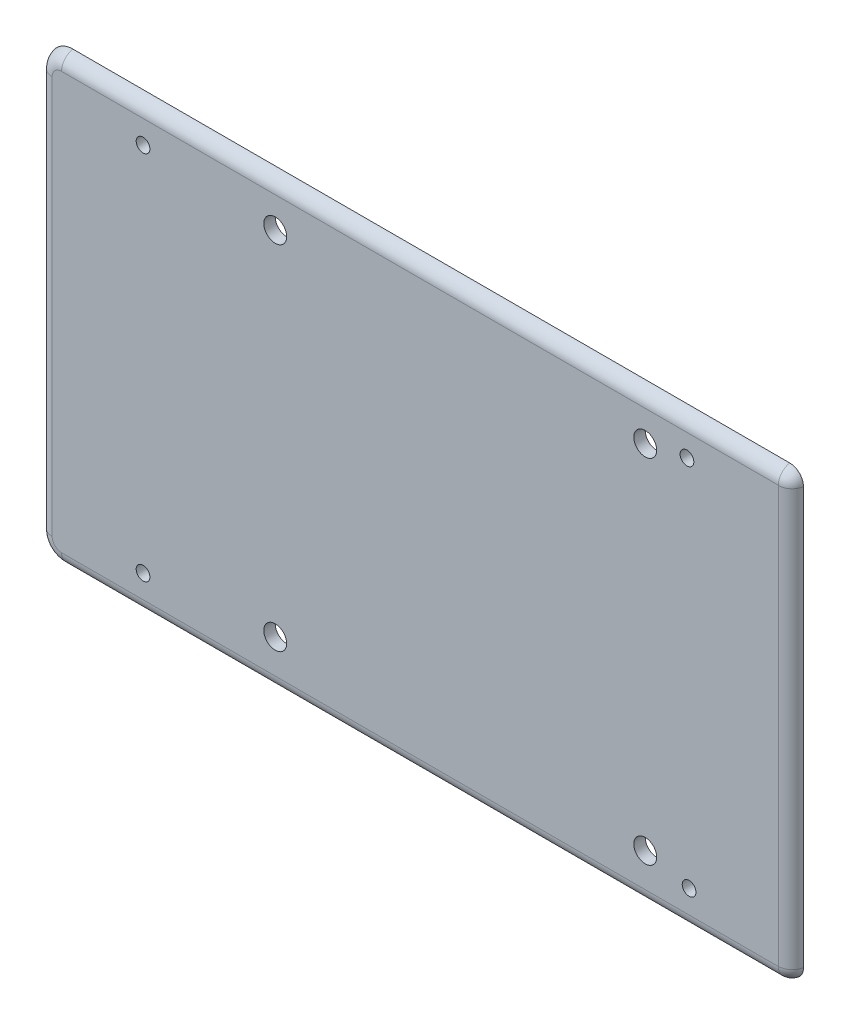
ISO-10303-21;
HEADER;
FILE_DESCRIPTION(('STEP AP214'),'2;1');
FILE_NAME('part.step','',(''),(''),'','','');
FILE_SCHEMA(('AUTOMOTIVE_DESIGN { 1 0 10303 214 1 1 1 1 }'));
ENDSEC;
DATA;
#1=APPLICATION_CONTEXT('core data for automotive mechanical design processes');
#2=APPLICATION_PROTOCOL_DEFINITION('international standard','automotive_design',2000,#1);
#3=PRODUCT_CONTEXT('',#1,'mechanical');
#4=PRODUCT('Part','Part','',(#3));
#5=PRODUCT_RELATED_PRODUCT_CATEGORY('part','',(#4));
#6=PRODUCT_DEFINITION_FORMATION('','',#4);
#7=PRODUCT_DEFINITION_CONTEXT('part definition',#1,'design');
#8=PRODUCT_DEFINITION('design','',#6,#7);
#9=PRODUCT_DEFINITION_SHAPE('','',#8);
#10=(LENGTH_UNIT() NAMED_UNIT(*) SI_UNIT(.MILLI.,.METRE.));
#11=(NAMED_UNIT(*) PLANE_ANGLE_UNIT() SI_UNIT($,.RADIAN.));
#12=(NAMED_UNIT(*) SI_UNIT($,.STERADIAN.) SOLID_ANGLE_UNIT());
#13=UNCERTAINTY_MEASURE_WITH_UNIT(LENGTH_MEASURE(1.E-05),#10,'distance_accuracy_value','');
#14=(GEOMETRIC_REPRESENTATION_CONTEXT(3) GLOBAL_UNCERTAINTY_ASSIGNED_CONTEXT((#13)) GLOBAL_UNIT_ASSIGNED_CONTEXT((#10,
#11,#12)) REPRESENTATION_CONTEXT('',''));
#15=CARTESIAN_POINT('',(0.,0.,0.));
#16=DIRECTION('',(0.,0.,1.));
#17=DIRECTION('',(1.,0.,0.));
#18=AXIS2_PLACEMENT_3D('',#15,#16,#17);
#19=CARTESIAN_POINT('',(-66.8142757664545,92.,2.5));
#20=DIRECTION('',(0.,0.,1.));
#21=DIRECTION('',(1.,0.,0.));
#22=AXIS2_PLACEMENT_3D('',#19,#20,#21);
#23=PLANE('',#22);
#24=DIRECTION('',(-1.,0.,0.));
#25=VECTOR('',#24,1.);
#26=CARTESIAN_POINT('',(89.8153903754205,2.95803989154979,2.5));
#27=LINE('',#26,#25);
#28=CARTESIAN_POINT('',(-66.8142757664545,2.95803989154981,2.5));
#29=VERTEX_POINT('',#28);
#30=CARTESIAN_POINT('',(89.8153903754205,2.95803989154979,2.5));
#31=VERTEX_POINT('',#30);
#32=EDGE_CURVE('E42',#29,#31,#27,.F.);
#33=ORIENTED_EDGE('',*,*,#32,.T.);
#34=CARTESIAN_POINT('',(89.8153903754205,2.99999999999998,2.5));
#35=DIRECTION('',(0.,0.,1.));
#36=DIRECTION('',(1.,0.,0.));
#37=AXIS2_PLACEMENT_3D('',#34,#35,#36);
#38=CIRCLE('',#37,0.0419601084501934);
#39=CARTESIAN_POINT('',(89.8573504838707,2.99999999999998,2.5));
#40=VERTEX_POINT('',#39);
#41=EDGE_CURVE('E11',#31,#40,#38,.T.);
#42=ORIENTED_EDGE('',*,*,#41,.T.);
#43=DIRECTION('',(0.,-1.,0.));
#44=VECTOR('',#43,1.);
#45=CARTESIAN_POINT('',(89.8573504838707,94.,2.5));
#46=LINE('',#45,#44);
#47=CARTESIAN_POINT('',(89.8573504838707,94.,2.5));
#48=VERTEX_POINT('',#47);
#49=EDGE_CURVE('E152',#40,#48,#46,.F.);
#50=ORIENTED_EDGE('',*,*,#49,.T.);
#51=CARTESIAN_POINT('',(89.8153903754205,94.,2.5));
#52=DIRECTION('',(0.,0.,1.));
#53=DIRECTION('',(1.,0.,0.));
#54=AXIS2_PLACEMENT_3D('',#51,#52,#53);
#55=CIRCLE('',#54,0.0419601084502012);
#56=CARTESIAN_POINT('',(89.8153903754205,94.0419601084502,2.5));
#57=VERTEX_POINT('',#56);
#58=EDGE_CURVE('E150',#48,#57,#55,.T.);
#59=ORIENTED_EDGE('',*,*,#58,.T.);
#60=DIRECTION('',(1.,0.,0.));
#61=VECTOR('',#60,1.);
#62=CARTESIAN_POINT('',(-66.8142757664545,94.0419601084502,2.5));
#63=LINE('',#62,#61);
#64=CARTESIAN_POINT('',(-66.8142757664545,94.0419601084502,2.5));
#65=VERTEX_POINT('',#64);
#66=EDGE_CURVE('E148',#57,#65,#63,.F.);
#67=ORIENTED_EDGE('',*,*,#66,.T.);
#68=CARTESIAN_POINT('',(-66.8142757664545,92.,2.5));
#69=DIRECTION('',(0.,0.,1.));
#70=DIRECTION('',(1.,0.,0.));
#71=AXIS2_PLACEMENT_3D('',#68,#69,#70);
#72=CIRCLE('',#71,2.0419601084502);
#73=CARTESIAN_POINT('',(-68.8562358749047,92.,2.5));
#74=VERTEX_POINT('',#73);
#75=EDGE_CURVE('E146',#65,#74,#72,.T.);
#76=ORIENTED_EDGE('',*,*,#75,.T.);
#77=DIRECTION('',(0.,1.,0.));
#78=VECTOR('',#77,1.);
#79=CARTESIAN_POINT('',(-68.8562358749048,5.,2.5));
#80=LINE('',#79,#78);
#81=CARTESIAN_POINT('',(-68.8562358749048,5.,2.5));
#82=VERTEX_POINT('',#81);
#83=EDGE_CURVE('E120',#74,#82,#80,.F.);
#84=ORIENTED_EDGE('',*,*,#83,.T.);
#85=CARTESIAN_POINT('',(-66.8142757664546,5.,2.5));
#86=DIRECTION('',(0.,0.,1.));
#87=DIRECTION('',(1.,0.,0.));
#88=AXIS2_PLACEMENT_3D('',#85,#86,#87);
#89=CIRCLE('',#88,2.0419601084502);
#90=EDGE_CURVE('E53',#82,#29,#89,.T.);
#91=ORIENTED_EDGE('',*,*,#90,.T.);
#92=EDGE_LOOP('',(#33,#42,#50,#59,#67,#76,#84,#91));
#93=FACE_BOUND('',#92,.T.);
#94=CARTESIAN_POINT('',(60.7315456513945,87.3502466896968,2.5));
#95=DIRECTION('',(0.,0.,1.));
#96=DIRECTION('',(1.,0.,0.));
#97=AXIS2_PLACEMENT_3D('',#94,#95,#96);
#98=CIRCLE('',#97,2.5);
#99=CARTESIAN_POINT('',(63.2315456513945,87.3502466896968,2.5));
#100=VERTEX_POINT('',#99);
#101=EDGE_CURVE('E205',#100,#100,#98,.T.);
#102=ORIENTED_EDGE('',*,*,#101,.F.);
#103=EDGE_LOOP('',(#102));
#104=FACE_BOUND('',#103,.T.);
#105=CARTESIAN_POINT('',(-20.1175901510747,10.3502466896967,2.5));
#106=DIRECTION('',(0.,0.,1.));
#107=DIRECTION('',(1.,0.,0.));
#108=AXIS2_PLACEMENT_3D('',#105,#106,#107);
#109=CIRCLE('',#108,2.50000000000001);
#110=CARTESIAN_POINT('',(-17.6175901510747,10.3502466896967,2.5));
#111=VERTEX_POINT('',#110);
#112=EDGE_CURVE('E199',#111,#111,#109,.T.);
#113=ORIENTED_EDGE('',*,*,#112,.F.);
#114=EDGE_LOOP('',(#113));
#115=FACE_BOUND('',#114,.T.);
#116=CARTESIAN_POINT('',(-20.1175901510747,87.3502466896968,2.5));
#117=DIRECTION('',(0.,0.,1.));
#118=DIRECTION('',(1.,0.,0.));
#119=AXIS2_PLACEMENT_3D('',#116,#117,#118);
#120=CIRCLE('',#119,2.50000000000001);
#121=CARTESIAN_POINT('',(-17.6175901510747,87.3502466896968,2.5));
#122=VERTEX_POINT('',#121);
#123=EDGE_CURVE('E121',#122,#122,#120,.T.);
#124=ORIENTED_EDGE('',*,*,#123,.F.);
#125=EDGE_LOOP('',(#124));
#126=FACE_BOUND('',#125,.T.);
#127=CARTESIAN_POINT('',(60.7315456513945,10.3502466896967,2.5));
#128=DIRECTION('',(0.,0.,1.));
#129=DIRECTION('',(1.,0.,0.));
#130=AXIS2_PLACEMENT_3D('',#127,#128,#129);
#131=CIRCLE('',#130,2.5);
#132=CARTESIAN_POINT('',(63.2315456513945,10.3502466896967,2.5));
#133=VERTEX_POINT('',#132);
#134=EDGE_CURVE('E193',#133,#133,#131,.T.);
#135=ORIENTED_EDGE('',*,*,#134,.F.);
#136=EDGE_LOOP('',(#135));
#137=FACE_BOUND('',#136,.T.);
#138=CARTESIAN_POINT('',(-49.,8.,2.5));
#139=DIRECTION('',(0.,0.,1.));
#140=DIRECTION('',(1.,0.,0.));
#141=AXIS2_PLACEMENT_3D('',#138,#139,#140);
#142=CIRCLE('',#141,1.5);
#143=CARTESIAN_POINT('',(-47.5,8.,2.5));
#144=VERTEX_POINT('',#143);
#145=EDGE_CURVE('E178',#144,#144,#142,.T.);
#146=ORIENTED_EDGE('',*,*,#145,.F.);
#147=EDGE_LOOP('',(#146));
#148=FACE_BOUND('',#147,.T.);
#149=CARTESIAN_POINT('',(69.8502021664019,89.2089025838735,2.5));
#150=DIRECTION('',(0.,0.,1.));
#151=DIRECTION('',(1.,0.,0.));
#152=AXIS2_PLACEMENT_3D('',#149,#150,#151);
#153=CIRCLE('',#152,1.5);
#154=CARTESIAN_POINT('',(71.3502021664019,89.2089025838735,2.5));
#155=VERTEX_POINT('',#154);
#156=EDGE_CURVE('E117',#155,#155,#153,.T.);
#157=ORIENTED_EDGE('',*,*,#156,.F.);
#158=EDGE_LOOP('',(#157));
#159=FACE_BOUND('',#158,.T.);
#160=CARTESIAN_POINT('',(-49.,89.,2.5));
#161=DIRECTION('',(0.,0.,1.));
#162=DIRECTION('',(1.,0.,0.));
#163=AXIS2_PLACEMENT_3D('',#160,#161,#162);
#164=CIRCLE('',#163,1.5);
#165=CARTESIAN_POINT('',(-47.5,89.,2.5));
#166=VERTEX_POINT('',#165);
#167=EDGE_CURVE('E172',#166,#166,#164,.T.);
#168=ORIENTED_EDGE('',*,*,#167,.F.);
#169=EDGE_LOOP('',(#168));
#170=FACE_BOUND('',#169,.T.);
#171=CARTESIAN_POINT('',(70.3153903754205,7.99999999999998,2.5));
#172=DIRECTION('',(0.,0.,1.));
#173=DIRECTION('',(1.,0.,0.));
#174=AXIS2_PLACEMENT_3D('',#171,#172,#173);
#175=CIRCLE('',#174,1.5);
#176=CARTESIAN_POINT('',(71.8153903754205,7.99999999999998,2.5));
#177=VERTEX_POINT('',#176);
#178=EDGE_CURVE('E184',#177,#177,#175,.T.);
#179=ORIENTED_EDGE('',*,*,#178,.F.);
#180=EDGE_LOOP('',(#179));
#181=FACE_BOUND('',#180,.T.);
#182=ADVANCED_FACE('F33',(#93,#104,#115,#126,#137,#148,#159,#170,#181),#23,.T.);
#183=CARTESIAN_POINT('',(-66.8142757664545,92.,0.));
#184=DIRECTION('',(0.,0.,1.));
#185=DIRECTION('',(1.,0.,0.));
#186=AXIS2_PLACEMENT_3D('',#183,#184,#185);
#187=PLANE('',#186);
#188=CARTESIAN_POINT('',(60.7315456513945,87.3502466896968,0.));
#189=DIRECTION('',(0.,0.,1.));
#190=DIRECTION('',(1.,0.,0.));
#191=AXIS2_PLACEMENT_3D('',#188,#189,#190);
#192=CIRCLE('',#191,2.5);
#193=CARTESIAN_POINT('',(63.2315456513945,87.3502466896968,0.));
#194=VERTEX_POINT('',#193);
#195=EDGE_CURVE('E196',#194,#194,#192,.T.);
#196=ORIENTED_EDGE('',*,*,#195,.T.);
#197=EDGE_LOOP('',(#196));
#198=FACE_BOUND('',#197,.T.);
#199=CARTESIAN_POINT('',(-20.1175901510747,10.3502466896967,0.));
#200=DIRECTION('',(0.,0.,1.));
#201=DIRECTION('',(1.,0.,0.));
#202=AXIS2_PLACEMENT_3D('',#199,#200,#201);
#203=CIRCLE('',#202,2.50000000000001);
#204=CARTESIAN_POINT('',(-17.6175901510747,10.3502466896967,0.));
#205=VERTEX_POINT('',#204);
#206=EDGE_CURVE('E202',#205,#205,#203,.T.);
#207=ORIENTED_EDGE('',*,*,#206,.T.);
#208=EDGE_LOOP('',(#207));
#209=FACE_BOUND('',#208,.T.);
#210=CARTESIAN_POINT('',(-20.1175901510747,87.3502466896968,0.));
#211=DIRECTION('',(0.,0.,1.));
#212=DIRECTION('',(1.,0.,0.));
#213=AXIS2_PLACEMENT_3D('',#210,#211,#212);
#214=CIRCLE('',#213,2.50000000000001);
#215=CARTESIAN_POINT('',(-17.6175901510747,87.3502466896968,0.));
#216=VERTEX_POINT('',#215);
#217=EDGE_CURVE('E123',#216,#216,#214,.T.);
#218=ORIENTED_EDGE('',*,*,#217,.T.);
#219=EDGE_LOOP('',(#218));
#220=FACE_BOUND('',#219,.T.);
#221=CARTESIAN_POINT('',(60.7315456513945,10.3502466896967,0.));
#222=DIRECTION('',(0.,0.,1.));
#223=DIRECTION('',(1.,0.,0.));
#224=AXIS2_PLACEMENT_3D('',#221,#222,#223);
#225=CIRCLE('',#224,2.5);
#226=CARTESIAN_POINT('',(63.2315456513945,10.3502466896967,0.));
#227=VERTEX_POINT('',#226);
#228=EDGE_CURVE('E190',#227,#227,#225,.T.);
#229=ORIENTED_EDGE('',*,*,#228,.T.);
#230=EDGE_LOOP('',(#229));
#231=FACE_BOUND('',#230,.T.);
#232=CARTESIAN_POINT('',(-66.8142757664545,92.,0.));
#233=DIRECTION('',(0.,0.,1.));
#234=DIRECTION('',(1.,0.,0.));
#235=AXIS2_PLACEMENT_3D('',#232,#233,#234);
#236=CIRCLE('',#235,5.);
#237=CARTESIAN_POINT('',(-66.8142757664545,97.,0.));
#238=VERTEX_POINT('',#237);
#239=CARTESIAN_POINT('',(-71.8142757664545,92.,0.));
#240=VERTEX_POINT('',#239);
#241=EDGE_CURVE('E101',#238,#240,#236,.T.);
#242=ORIENTED_EDGE('',*,*,#241,.F.);
#243=DIRECTION('',(-1.,0.,0.));
#244=VECTOR('',#243,1.);
#245=CARTESIAN_POINT('',(89.8153903754205,97.,0.));
#246=LINE('',#245,#244);
#247=CARTESIAN_POINT('',(89.8153903754205,97.,0.));
#248=VERTEX_POINT('',#247);
#249=EDGE_CURVE('E154',#248,#238,#246,.T.);
#250=ORIENTED_EDGE('',*,*,#249,.F.);
#251=CARTESIAN_POINT('',(89.8153903754205,94.,0.));
#252=DIRECTION('',(0.,0.,1.));
#253=DIRECTION('',(1.,0.,0.));
#254=AXIS2_PLACEMENT_3D('',#251,#252,#253);
#255=CIRCLE('',#254,3.00000000000001);
#256=CARTESIAN_POINT('',(92.8153903754205,94.,0.));
#257=VERTEX_POINT('',#256);
#258=EDGE_CURVE('E156',#257,#248,#255,.T.);
#259=ORIENTED_EDGE('',*,*,#258,.F.);
#260=DIRECTION('',(0.,1.,0.));
#261=VECTOR('',#260,1.);
#262=CARTESIAN_POINT('',(92.8153903754205,2.99999999999998,0.));
#263=LINE('',#262,#261);
#264=CARTESIAN_POINT('',(92.8153903754205,2.99999999999998,0.));
#265=VERTEX_POINT('',#264);
#266=EDGE_CURVE('E159',#265,#257,#263,.T.);
#267=ORIENTED_EDGE('',*,*,#266,.F.);
#268=CARTESIAN_POINT('',(89.8153903754205,2.99999999999998,0.));
#269=DIRECTION('',(0.,0.,1.));
#270=DIRECTION('',(1.,0.,0.));
#271=AXIS2_PLACEMENT_3D('',#268,#269,#270);
#272=CIRCLE('',#271,3.);
#273=CARTESIAN_POINT('',(89.8153903754205,0.,0.));
#274=VERTEX_POINT('',#273);
#275=EDGE_CURVE('E162',#274,#265,#272,.T.);
#276=ORIENTED_EDGE('',*,*,#275,.F.);
#277=DIRECTION('',(1.,0.,0.));
#278=VECTOR('',#277,1.);
#279=CARTESIAN_POINT('',(-66.8142757664545,0.,0.));
#280=LINE('',#279,#278);
#281=CARTESIAN_POINT('',(-66.8142757664545,0.,0.));
#282=VERTEX_POINT('',#281);
#283=EDGE_CURVE('E165',#282,#274,#280,.T.);
#284=ORIENTED_EDGE('',*,*,#283,.F.);
#285=CARTESIAN_POINT('',(-66.8142757664546,5.,0.));
#286=DIRECTION('',(0.,0.,1.));
#287=DIRECTION('',(1.,0.,0.));
#288=AXIS2_PLACEMENT_3D('',#285,#286,#287);
#289=CIRCLE('',#288,5.);
#290=CARTESIAN_POINT('',(-71.8142757664546,5.,0.));
#291=VERTEX_POINT('',#290);
#292=EDGE_CURVE('E104',#291,#282,#289,.T.);
#293=ORIENTED_EDGE('',*,*,#292,.F.);
#294=DIRECTION('',(0.,-1.,0.));
#295=VECTOR('',#294,1.);
#296=CARTESIAN_POINT('',(-71.8142757664545,92.,0.));
#297=LINE('',#296,#295);
#298=EDGE_CURVE('E97',#240,#291,#297,.T.);
#299=ORIENTED_EDGE('',*,*,#298,.F.);
#300=EDGE_LOOP('',(#242,#250,#259,#267,#276,#284,#293,#299));
#301=FACE_BOUND('',#300,.T.);
#302=CARTESIAN_POINT('',(69.8502021664019,89.2089025838735,0.));
#303=DIRECTION('',(0.,0.,1.));
#304=DIRECTION('',(1.,0.,0.));
#305=AXIS2_PLACEMENT_3D('',#302,#303,#304);
#306=CIRCLE('',#305,1.5);
#307=CARTESIAN_POINT('',(71.3502021664019,89.2089025838735,0.));
#308=VERTEX_POINT('',#307);
#309=EDGE_CURVE('E169',#308,#308,#306,.T.);
#310=ORIENTED_EDGE('',*,*,#309,.T.);
#311=EDGE_LOOP('',(#310));
#312=FACE_BOUND('',#311,.T.);
#313=CARTESIAN_POINT('',(-49.,89.,0.));
#314=DIRECTION('',(0.,0.,1.));
#315=DIRECTION('',(1.,0.,0.));
#316=AXIS2_PLACEMENT_3D('',#313,#314,#315);
#317=CIRCLE('',#316,1.5);
#318=CARTESIAN_POINT('',(-47.5,89.,0.));
#319=VERTEX_POINT('',#318);
#320=EDGE_CURVE('E175',#319,#319,#317,.T.);
#321=ORIENTED_EDGE('',*,*,#320,.T.);
#322=EDGE_LOOP('',(#321));
#323=FACE_BOUND('',#322,.T.);
#324=CARTESIAN_POINT('',(-49.,8.,0.));
#325=DIRECTION('',(0.,0.,1.));
#326=DIRECTION('',(1.,0.,0.));
#327=AXIS2_PLACEMENT_3D('',#324,#325,#326);
#328=CIRCLE('',#327,1.5);
#329=CARTESIAN_POINT('',(-47.5,8.,0.));
#330=VERTEX_POINT('',#329);
#331=EDGE_CURVE('E181',#330,#330,#328,.T.);
#332=ORIENTED_EDGE('',*,*,#331,.T.);
#333=EDGE_LOOP('',(#332));
#334=FACE_BOUND('',#333,.T.);
#335=CARTESIAN_POINT('',(70.3153903754205,7.99999999999998,0.));
#336=DIRECTION('',(0.,0.,1.));
#337=DIRECTION('',(1.,0.,0.));
#338=AXIS2_PLACEMENT_3D('',#335,#336,#337);
#339=CIRCLE('',#338,1.5);
#340=CARTESIAN_POINT('',(71.8153903754205,7.99999999999998,0.));
#341=VERTEX_POINT('',#340);
#342=EDGE_CURVE('E187',#341,#341,#339,.T.);
#343=ORIENTED_EDGE('',*,*,#342,.T.);
#344=EDGE_LOOP('',(#343));
#345=FACE_BOUND('',#344,.T.);
#346=ADVANCED_FACE('F99',(#198,#209,#220,#231,#301,#312,#323,#334,#345),#187,.F.);
#347=CARTESIAN_POINT('',(69.8502021664019,89.2089025838735,2.5));
#348=DIRECTION('',(0.,0.,-1.));
#349=DIRECTION('',(-1.,0.,0.));
#350=AXIS2_PLACEMENT_3D('',#347,#348,#349);
#351=CYLINDRICAL_SURFACE('',#350,1.5);
#352=ORIENTED_EDGE('',*,*,#156,.T.);
#353=EDGE_LOOP('',(#352));
#354=FACE_BOUND('',#353,.T.);
#355=ORIENTED_EDGE('',*,*,#309,.F.);
#356=EDGE_LOOP('',(#355));
#357=FACE_BOUND('',#356,.T.);
#358=ADVANCED_FACE('F244',(#354,#357),#351,.F.);
#359=CARTESIAN_POINT('',(-49.,89.,2.5));
#360=DIRECTION('',(0.,0.,-1.));
#361=DIRECTION('',(-1.,0.,0.));
#362=AXIS2_PLACEMENT_3D('',#359,#360,#361);
#363=CYLINDRICAL_SURFACE('',#362,1.5);
#364=ORIENTED_EDGE('',*,*,#167,.T.);
#365=EDGE_LOOP('',(#364));
#366=FACE_BOUND('',#365,.T.);
#367=ORIENTED_EDGE('',*,*,#320,.F.);
#368=EDGE_LOOP('',(#367));
#369=FACE_BOUND('',#368,.T.);
#370=ADVANCED_FACE('F250',(#366,#369),#363,.F.);
#371=CARTESIAN_POINT('',(-49.,8.,2.5));
#372=DIRECTION('',(0.,0.,-1.));
#373=DIRECTION('',(-1.,0.,0.));
#374=AXIS2_PLACEMENT_3D('',#371,#372,#373);
#375=CYLINDRICAL_SURFACE('',#374,1.5);
#376=ORIENTED_EDGE('',*,*,#145,.T.);
#377=EDGE_LOOP('',(#376));
#378=FACE_BOUND('',#377,.T.);
#379=ORIENTED_EDGE('',*,*,#331,.F.);
#380=EDGE_LOOP('',(#379));
#381=FACE_BOUND('',#380,.T.);
#382=ADVANCED_FACE('F239',(#378,#381),#375,.F.);
#383=CARTESIAN_POINT('',(70.3153903754205,7.99999999999998,2.5));
#384=DIRECTION('',(0.,0.,-1.));
#385=DIRECTION('',(-1.,0.,0.));
#386=AXIS2_PLACEMENT_3D('',#383,#384,#385);
#387=CYLINDRICAL_SURFACE('',#386,1.5);
#388=ORIENTED_EDGE('',*,*,#178,.T.);
#389=EDGE_LOOP('',(#388));
#390=FACE_BOUND('',#389,.T.);
#391=ORIENTED_EDGE('',*,*,#342,.F.);
#392=EDGE_LOOP('',(#391));
#393=FACE_BOUND('',#392,.T.);
#394=ADVANCED_FACE('F236',(#390,#393),#387,.F.);
#395=CARTESIAN_POINT('',(60.7315456513945,10.3502466896967,0.));
#396=DIRECTION('',(0.,0.,1.));
#397=DIRECTION('',(1.,0.,0.));
#398=AXIS2_PLACEMENT_3D('',#395,#396,#397);
#399=CYLINDRICAL_SURFACE('',#398,2.5);
#400=ORIENTED_EDGE('',*,*,#228,.F.);
#401=EDGE_LOOP('',(#400));
#402=FACE_BOUND('',#401,.T.);
#403=ORIENTED_EDGE('',*,*,#134,.T.);
#404=EDGE_LOOP('',(#403));
#405=FACE_BOUND('',#404,.T.);
#406=ADVANCED_FACE('F219',(#402,#405),#399,.F.);
#407=CARTESIAN_POINT('',(-20.1175901510747,87.3502466896968,0.));
#408=DIRECTION('',(0.,0.,1.));
#409=DIRECTION('',(1.,0.,0.));
#410=AXIS2_PLACEMENT_3D('',#407,#408,#409);
#411=CYLINDRICAL_SURFACE('',#410,2.50000000000001);
#412=ORIENTED_EDGE('',*,*,#217,.F.);
#413=EDGE_LOOP('',(#412));
#414=FACE_BOUND('',#413,.T.);
#415=ORIENTED_EDGE('',*,*,#123,.T.);
#416=EDGE_LOOP('',(#415));
#417=FACE_BOUND('',#416,.T.);
#418=ADVANCED_FACE('F215',(#414,#417),#411,.F.);
#419=CARTESIAN_POINT('',(-20.1175901510747,10.3502466896967,0.));
#420=DIRECTION('',(0.,0.,1.));
#421=DIRECTION('',(1.,0.,0.));
#422=AXIS2_PLACEMENT_3D('',#419,#420,#421);
#423=CYLINDRICAL_SURFACE('',#422,2.50000000000001);
#424=ORIENTED_EDGE('',*,*,#206,.F.);
#425=EDGE_LOOP('',(#424));
#426=FACE_BOUND('',#425,.T.);
#427=ORIENTED_EDGE('',*,*,#112,.T.);
#428=EDGE_LOOP('',(#427));
#429=FACE_BOUND('',#428,.T.);
#430=ADVANCED_FACE('F218',(#426,#429),#423,.F.);
#431=CARTESIAN_POINT('',(60.7315456513945,87.3502466896968,0.));
#432=DIRECTION('',(0.,0.,1.));
#433=DIRECTION('',(1.,0.,0.));
#434=AXIS2_PLACEMENT_3D('',#431,#432,#433);
#435=CYLINDRICAL_SURFACE('',#434,2.5);
#436=ORIENTED_EDGE('',*,*,#195,.F.);
#437=EDGE_LOOP('',(#436));
#438=FACE_BOUND('',#437,.T.);
#439=ORIENTED_EDGE('',*,*,#101,.T.);
#440=EDGE_LOOP('',(#439));
#441=FACE_BOUND('',#440,.T.);
#442=ADVANCED_FACE('F281',(#438,#441),#435,.F.);
#443=CARTESIAN_POINT('',(-66.8142757664545,92.,-0.5));
#444=DIRECTION('',(0.,0.,-1.));
#445=DIRECTION('',(-1.,0.,0.));
#446=AXIS2_PLACEMENT_3D('',#443,#444,#445);
#447=DEGENERATE_TOROIDAL_SURFACE('',#446,2.0419601084502,3.,.T.);
#448=CARTESIAN_POINT('',(-66.8142757664545,94.0419601084502,-0.5));
#449=DIRECTION('',(1.,0.,0.));
#450=DIRECTION('',(0.,0.,-1.));
#451=AXIS2_PLACEMENT_3D('',#448,#449,#450);
#452=CIRCLE('',#451,3.);
#453=EDGE_CURVE('E115',#238,#65,#452,.T.);
#454=ORIENTED_EDGE('',*,*,#453,.F.);
#455=ORIENTED_EDGE('',*,*,#241,.T.);
#456=CARTESIAN_POINT('',(-68.8562358749047,92.,-0.5));
#457=DIRECTION('',(0.,-1.,0.));
#458=DIRECTION('',(0.,0.,-1.));
#459=AXIS2_PLACEMENT_3D('',#456,#457,#458);
#460=CIRCLE('',#459,3.);
#461=EDGE_CURVE('E37',#74,#240,#460,.T.);
#462=ORIENTED_EDGE('',*,*,#461,.F.);
#463=ORIENTED_EDGE('',*,*,#75,.F.);
#464=EDGE_LOOP('',(#454,#455,#462,#463));
#465=FACE_BOUND('',#464,.T.);
#466=ADVANCED_FACE('F35',(#465),#447,.T.);
#467=CARTESIAN_POINT('',(-68.8562358749047,92.,-0.5));
#468=DIRECTION('',(0.,-1.,0.));
#469=DIRECTION('',(1.,0.,0.));
#470=AXIS2_PLACEMENT_3D('',#467,#468,#469);
#471=CYLINDRICAL_SURFACE('',#470,3.);
#472=ORIENTED_EDGE('',*,*,#461,.T.);
#473=ORIENTED_EDGE('',*,*,#298,.T.);
#474=CARTESIAN_POINT('',(-68.8562358749048,5.,-0.5));
#475=DIRECTION('',(0.,-1.,0.));
#476=DIRECTION('',(1.,0.,0.));
#477=AXIS2_PLACEMENT_3D('',#474,#475,#476);
#478=CIRCLE('',#477,3.);
#479=EDGE_CURVE('E125',#82,#291,#478,.T.);
#480=ORIENTED_EDGE('',*,*,#479,.F.);
#481=ORIENTED_EDGE('',*,*,#83,.F.);
#482=EDGE_LOOP('',(#472,#473,#480,#481));
#483=FACE_BOUND('',#482,.T.);
#484=ADVANCED_FACE('F119',(#483),#471,.T.);
#485=CARTESIAN_POINT('',(89.8153903754205,94.0419601084502,-0.5));
#486=DIRECTION('',(-1.,0.,0.));
#487=DIRECTION('',(0.,-1.,0.));
#488=AXIS2_PLACEMENT_3D('',#485,#486,#487);
#489=CYLINDRICAL_SURFACE('',#488,3.);
#490=ORIENTED_EDGE('',*,*,#453,.T.);
#491=ORIENTED_EDGE('',*,*,#66,.F.);
#492=CARTESIAN_POINT('',(89.8153903754205,94.0419601084502,-0.5));
#493=DIRECTION('',(1.,0.,0.));
#494=DIRECTION('',(0.,0.,-1.));
#495=AXIS2_PLACEMENT_3D('',#492,#493,#494);
#496=CIRCLE('',#495,3.);
#497=EDGE_CURVE('E128',#248,#57,#496,.T.);
#498=ORIENTED_EDGE('',*,*,#497,.F.);
#499=ORIENTED_EDGE('',*,*,#249,.T.);
#500=EDGE_LOOP('',(#490,#491,#498,#499));
#501=FACE_BOUND('',#500,.T.);
#502=ADVANCED_FACE('F274',(#501),#489,.T.);
#503=CARTESIAN_POINT('',(-66.8142757664546,5.,-0.5));
#504=DIRECTION('',(0.,0.,-1.));
#505=DIRECTION('',(-1.,0.,0.));
#506=AXIS2_PLACEMENT_3D('',#503,#504,#505);
#507=DEGENERATE_TOROIDAL_SURFACE('',#506,2.0419601084502,3.,.T.);
#508=ORIENTED_EDGE('',*,*,#479,.T.);
#509=ORIENTED_EDGE('',*,*,#292,.T.);
#510=CARTESIAN_POINT('',(-66.8142757664545,2.95803989154981,-0.5));
#511=DIRECTION('',(1.,0.,0.));
#512=DIRECTION('',(0.,1.,0.));
#513=AXIS2_PLACEMENT_3D('',#510,#511,#512);
#514=CIRCLE('',#513,3.);
#515=EDGE_CURVE('E133',#29,#282,#514,.T.);
#516=ORIENTED_EDGE('',*,*,#515,.F.);
#517=ORIENTED_EDGE('',*,*,#90,.F.);
#518=EDGE_LOOP('',(#508,#509,#516,#517));
#519=FACE_BOUND('',#518,.T.);
#520=ADVANCED_FACE('F270',(#519),#507,.T.);
#521=CARTESIAN_POINT('',(89.8153903754205,94.,-0.5));
#522=DIRECTION('',(0.,0.,-1.));
#523=DIRECTION('',(-1.,0.,0.));
#524=AXIS2_PLACEMENT_3D('',#521,#522,#523);
#525=DEGENERATE_TOROIDAL_SURFACE('',#524,0.0419601084502012,3.,.T.);
#526=ORIENTED_EDGE('',*,*,#497,.T.);
#527=ORIENTED_EDGE('',*,*,#58,.F.);
#528=CARTESIAN_POINT('',(89.8573504838707,94.,-0.5));
#529=DIRECTION('',(0.,-1.,0.));
#530=DIRECTION('',(0.,0.,-1.));
#531=AXIS2_PLACEMENT_3D('',#528,#529,#530);
#532=CIRCLE('',#531,3.);
#533=EDGE_CURVE('E136',#257,#48,#532,.T.);
#534=ORIENTED_EDGE('',*,*,#533,.F.);
#535=ORIENTED_EDGE('',*,*,#258,.T.);
#536=EDGE_LOOP('',(#526,#527,#534,#535));
#537=FACE_BOUND('',#536,.T.);
#538=ADVANCED_FACE('F266',(#537),#525,.T.);
#539=CARTESIAN_POINT('',(-66.8142757664545,2.95803989154981,-0.5));
#540=DIRECTION('',(1.,0.,0.));
#541=DIRECTION('',(0.,1.,0.));
#542=AXIS2_PLACEMENT_3D('',#539,#540,#541);
#543=CYLINDRICAL_SURFACE('',#542,3.);
#544=ORIENTED_EDGE('',*,*,#515,.T.);
#545=ORIENTED_EDGE('',*,*,#283,.T.);
#546=CARTESIAN_POINT('',(89.8153903754205,2.95803989154979,-0.5));
#547=DIRECTION('',(1.,0.,0.));
#548=DIRECTION('',(0.,0.,-1.));
#549=AXIS2_PLACEMENT_3D('',#546,#547,#548);
#550=CIRCLE('',#549,3.);
#551=EDGE_CURVE('E139',#31,#274,#550,.T.);
#552=ORIENTED_EDGE('',*,*,#551,.F.);
#553=ORIENTED_EDGE('',*,*,#32,.F.);
#554=EDGE_LOOP('',(#544,#545,#552,#553));
#555=FACE_BOUND('',#554,.T.);
#556=ADVANCED_FACE('F262',(#555),#543,.T.);
#557=CARTESIAN_POINT('',(89.8573504838707,2.99999999999998,-0.5));
#558=DIRECTION('',(0.,1.,0.));
#559=DIRECTION('',(-1.,0.,0.));
#560=AXIS2_PLACEMENT_3D('',#557,#558,#559);
#561=CYLINDRICAL_SURFACE('',#560,3.);
#562=ORIENTED_EDGE('',*,*,#533,.T.);
#563=ORIENTED_EDGE('',*,*,#49,.F.);
#564=CARTESIAN_POINT('',(89.8573504838707,2.99999999999998,-0.5));
#565=DIRECTION('',(0.,-1.,0.));
#566=DIRECTION('',(1.,0.,0.));
#567=AXIS2_PLACEMENT_3D('',#564,#565,#566);
#568=CIRCLE('',#567,3.);
#569=EDGE_CURVE('E141',#265,#40,#568,.T.);
#570=ORIENTED_EDGE('',*,*,#569,.F.);
#571=ORIENTED_EDGE('',*,*,#266,.T.);
#572=EDGE_LOOP('',(#562,#563,#570,#571));
#573=FACE_BOUND('',#572,.T.);
#574=ADVANCED_FACE('F258',(#573),#561,.T.);
#575=CARTESIAN_POINT('',(89.8153903754205,2.99999999999998,-0.5));
#576=DIRECTION('',(0.,0.,-1.));
#577=DIRECTION('',(-1.,0.,0.));
#578=AXIS2_PLACEMENT_3D('',#575,#576,#577);
#579=DEGENERATE_TOROIDAL_SURFACE('',#578,0.0419601084501934,3.,.T.);
#580=ORIENTED_EDGE('',*,*,#551,.T.);
#581=ORIENTED_EDGE('',*,*,#275,.T.);
#582=ORIENTED_EDGE('',*,*,#569,.T.);
#583=ORIENTED_EDGE('',*,*,#41,.F.);
#584=EDGE_LOOP('',(#580,#581,#582,#583));
#585=FACE_BOUND('',#584,.T.);
#586=ADVANCED_FACE('F255',(#585),#579,.T.);
#587=CLOSED_SHELL('',(#182,#346,#358,#370,#382,#394,#406,#418,#430,#442,#466,#484,#502,#520,
#538,#556,#574,#586));
#588=MANIFOLD_SOLID_BREP('B2',#587);
#589=ADVANCED_BREP_SHAPE_REPRESENTATION('',(#18,#588),#14);
#590=SHAPE_DEFINITION_REPRESENTATION(#9,#589);
ENDSEC;
END-ISO-10303-21;
